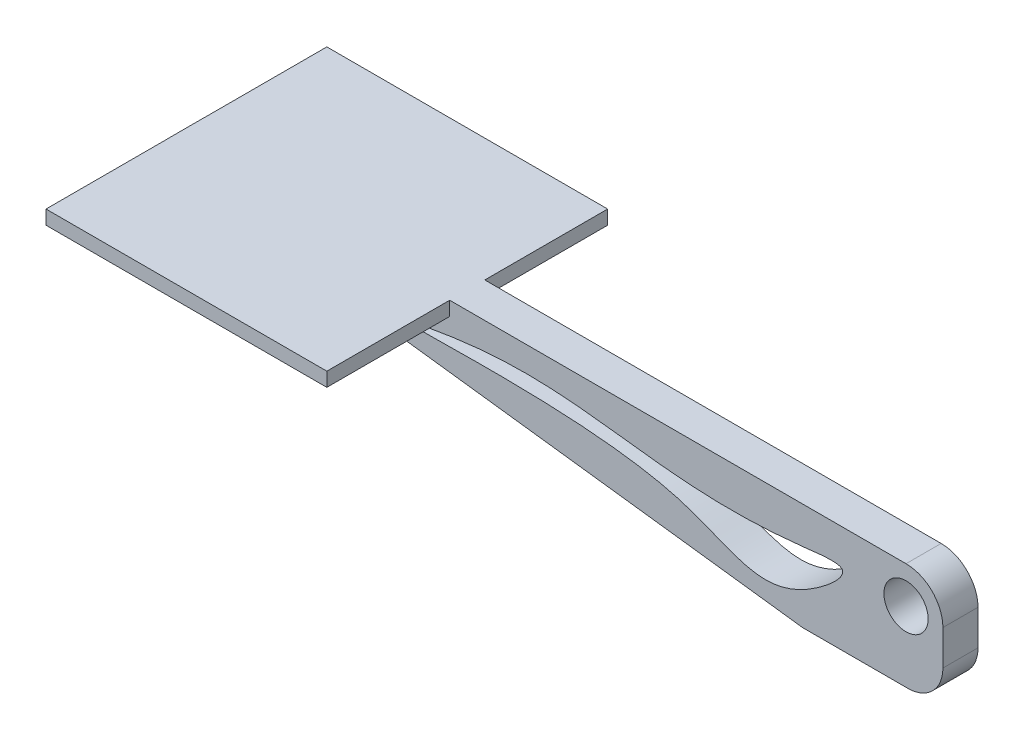
ISO-10303-21;
HEADER;
FILE_DESCRIPTION(('STEP AP214'),'2;1');
FILE_NAME('part.step','',(''),(''),'','','');
FILE_SCHEMA(('AUTOMOTIVE_DESIGN { 1 0 10303 214 1 1 1 1 }'));
ENDSEC;
DATA;
#1=APPLICATION_CONTEXT('core data for automotive mechanical design processes');
#2=APPLICATION_PROTOCOL_DEFINITION('international standard','automotive_design',2000,#1);
#3=PRODUCT_CONTEXT('',#1,'mechanical');
#4=PRODUCT('Part','Part','',(#3));
#5=PRODUCT_RELATED_PRODUCT_CATEGORY('part','',(#4));
#6=PRODUCT_DEFINITION_FORMATION('','',#4);
#7=PRODUCT_DEFINITION_CONTEXT('part definition',#1,'design');
#8=PRODUCT_DEFINITION('design','',#6,#7);
#9=PRODUCT_DEFINITION_SHAPE('','',#8);
#10=(LENGTH_UNIT() NAMED_UNIT(*) SI_UNIT(.MILLI.,.METRE.));
#11=(NAMED_UNIT(*) PLANE_ANGLE_UNIT() SI_UNIT($,.RADIAN.));
#12=(NAMED_UNIT(*) SI_UNIT($,.STERADIAN.) SOLID_ANGLE_UNIT());
#13=UNCERTAINTY_MEASURE_WITH_UNIT(LENGTH_MEASURE(1.E-05),#10,'distance_accuracy_value','');
#14=(GEOMETRIC_REPRESENTATION_CONTEXT(3) GLOBAL_UNCERTAINTY_ASSIGNED_CONTEXT((#13)) GLOBAL_UNIT_ASSIGNED_CONTEXT((#10,
#11,#12)) REPRESENTATION_CONTEXT('',''));
#15=CARTESIAN_POINT('',(0.,0.,0.));
#16=DIRECTION('',(0.,0.,1.));
#17=DIRECTION('',(1.,0.,0.));
#18=AXIS2_PLACEMENT_3D('',#15,#16,#17);
#19=CARTESIAN_POINT('',(0.,0.,-5.));
#20=DIRECTION('',(0.,0.,1.));
#21=DIRECTION('',(1.,0.,0.));
#22=AXIS2_PLACEMENT_3D('',#19,#20,#21);
#23=PLANE('',#22);
#24=CARTESIAN_POINT('',(-29.5,0.,-5.));
#25=CARTESIAN_POINT('',(-71.2154527835419,-4.61892144301834,-5.));
#26=CARTESIAN_POINT('',(-91.249553359035,8.29560441948552,-5.));
#27=CARTESIAN_POINT('',(-167.314221677609,-4.51637823923124,-5.));
#28=CARTESIAN_POINT('',(-66.6604627525352,5.70599052736748,-5.));
#29=CARTESIAN_POINT('',(-39.3547437867582,-20.8236487299259,-5.));
#30=CARTESIAN_POINT('',(-11.8773746369472,2.38963550250183,-5.));
#31=CARTESIAN_POINT('',(-24.5233427174819,0.551037745078615,-5.));
#32=CARTESIAN_POINT('',(-29.5,0.,-5.));
#33=B_SPLINE_CURVE_WITH_KNOTS('',3,(#24,#25,#26,#27,#28,#29,#30,#31,#32),.UNSPECIFIED.,.T.,.F.,
(4,1,1,1,1,1,4),(0.,0.381705306503049,0.445280413079072,0.748987595762117,0.891875490341652,
0.954462522479591,1.),.UNSPECIFIED.);
#34=CARTESIAN_POINT('',(-29.5,0.,-5.));
#35=VERTEX_POINT('',#34);
#36=EDGE_CURVE('E313',#35,#35,#33,.T.);
#37=ORIENTED_EDGE('',*,*,#36,.T.);
#38=EDGE_LOOP('',(#37));
#39=FACE_BOUND('',#38,.T.);
#40=CARTESIAN_POINT('',(0.,0.,-5.));
#41=DIRECTION('',(0.,0.,1.));
#42=DIRECTION('',(1.,0.,0.));
#43=AXIS2_PLACEMENT_3D('',#40,#41,#42);
#44=CIRCLE('',#43,6.3);
#45=CARTESIAN_POINT('',(6.3,0.,-5.));
#46=VERTEX_POINT('',#45);
#47=EDGE_CURVE('E280',#46,#46,#44,.T.);
#48=ORIENTED_EDGE('',*,*,#47,.T.);
#49=EDGE_LOOP('',(#48));
#50=FACE_BOUND('',#49,.T.);
#51=DIRECTION('',(0.,1.,0.));
#52=VECTOR('',#51,1.);
#53=CARTESIAN_POINT('',(-210.,0.,-5.));
#54=LINE('',#53,#52);
#55=CARTESIAN_POINT('',(-210.,6.49999999999997,-5.));
#56=VERTEX_POINT('',#55);
#57=CARTESIAN_POINT('',(-210.,10.5,-5.));
#58=VERTEX_POINT('',#57);
#59=EDGE_CURVE('E239',#56,#58,#54,.T.);
#60=ORIENTED_EDGE('',*,*,#59,.F.);
#61=DIRECTION('',(-1.,0.,0.));
#62=VECTOR('',#61,1.);
#63=CARTESIAN_POINT('',(0.,6.5,-5.));
#64=LINE('',#63,#62);
#65=CARTESIAN_POINT('',(-130.,6.49999999999998,-5.));
#66=VERTEX_POINT('',#65);
#67=EDGE_CURVE('E79',#66,#56,#64,.T.);
#68=ORIENTED_EDGE('',*,*,#67,.F.);
#69=DIRECTION('',(0.,1.,0.));
#70=VECTOR('',#69,1.);
#71=CARTESIAN_POINT('',(-130.,0.,-5.));
#72=LINE('',#71,#70);
#73=CARTESIAN_POINT('',(-130.,10.5,-5.));
#74=VERTEX_POINT('',#73);
#75=EDGE_CURVE('E237',#66,#74,#72,.T.);
#76=ORIENTED_EDGE('',*,*,#75,.T.);
#77=DIRECTION('',(-1.,0.,0.));
#78=VECTOR('',#77,1.);
#79=CARTESIAN_POINT('',(0.,10.5,-5.));
#80=LINE('',#79,#78);
#81=CARTESIAN_POINT('',(0.,10.5,-5.));
#82=VERTEX_POINT('',#81);
#83=EDGE_CURVE('E289',#82,#74,#80,.T.);
#84=ORIENTED_EDGE('',*,*,#83,.F.);
#85=CARTESIAN_POINT('',(0.,0.,-5.));
#86=DIRECTION('',(0.,0.,1.));
#87=DIRECTION('',(1.,0.,0.));
#88=AXIS2_PLACEMENT_3D('',#85,#86,#87);
#89=CIRCLE('',#88,10.5);
#90=CARTESIAN_POINT('',(10.5,0.,-5.));
#91=VERTEX_POINT('',#90);
#92=EDGE_CURVE('E286',#91,#82,#89,.T.);
#93=ORIENTED_EDGE('',*,*,#92,.F.);
#94=DIRECTION('',(0.,-1.,0.));
#95=VECTOR('',#94,1.);
#96=CARTESIAN_POINT('',(10.5,0.,-5.));
#97=LINE('',#96,#95);
#98=CARTESIAN_POINT('',(10.5,-9.99999999999993,-5.));
#99=VERTEX_POINT('',#98);
#100=EDGE_CURVE('E311',#91,#99,#97,.T.);
#101=ORIENTED_EDGE('',*,*,#100,.T.);
#102=CARTESIAN_POINT('',(0.500000000000002,-10.,-5.));
#103=DIRECTION('',(0.,0.,1.));
#104=DIRECTION('',(1.,0.,0.));
#105=AXIS2_PLACEMENT_3D('',#102,#103,#104);
#106=CIRCLE('',#105,10.);
#107=CARTESIAN_POINT('',(0.499999999999931,-20.,-5.));
#108=VERTEX_POINT('',#107);
#109=EDGE_CURVE('E308',#108,#99,#106,.T.);
#110=ORIENTED_EDGE('',*,*,#109,.F.);
#111=DIRECTION('',(-1.,0.,0.));
#112=VECTOR('',#111,1.);
#113=CARTESIAN_POINT('',(0.,-20.,-5.));
#114=LINE('',#113,#112);
#115=CARTESIAN_POINT('',(-29.5,-20.,-5.));
#116=VERTEX_POINT('',#115);
#117=EDGE_CURVE('E305',#108,#116,#114,.T.);
#118=ORIENTED_EDGE('',*,*,#117,.T.);
#119=DIRECTION('',(-0.992075031779354,0.125646851611941,0.));
#120=VECTOR('',#119,1.);
#121=CARTESIAN_POINT('',(-2.95874246005763,-23.361464950624,-5.));
#122=LINE('',#121,#120);
#123=CARTESIAN_POINT('',(-168.748530027059,-2.36409663681365,-5.));
#124=VERTEX_POINT('',#123);
#125=EDGE_CURVE('E303',#116,#124,#122,.T.);
#126=ORIENTED_EDGE('',*,*,#125,.T.);
#127=CARTESIAN_POINT('',(-171.261467059298,-22.2055972724007,-5.));
#128=DIRECTION('',(0.,0.,1.));
#129=DIRECTION('',(1.,0.,0.));
#130=AXIS2_PLACEMENT_3D('',#127,#128,#129);
#131=CIRCLE('',#130,20.);
#132=CARTESIAN_POINT('',(-171.261467059298,-2.20559727240073,-5.));
#133=VERTEX_POINT('',#132);
#134=EDGE_CURVE('E300',#133,#124,#131,.F.);
#135=ORIENTED_EDGE('',*,*,#134,.F.);
#136=DIRECTION('',(-1.,0.,0.));
#137=VECTOR('',#136,1.);
#138=CARTESIAN_POINT('',(0.,-2.20559727240071,-5.));
#139=LINE('',#138,#137);
#140=CARTESIAN_POINT('',(-202.51657919674,-2.20559727240073,-5.));
#141=VERTEX_POINT('',#140);
#142=EDGE_CURVE('E297',#133,#141,#139,.T.);
#143=ORIENTED_EDGE('',*,*,#142,.T.);
#144=CARTESIAN_POINT('',(-202.51657919674,5.29440272759927,-5.));
#145=DIRECTION('',(0.,0.,1.));
#146=DIRECTION('',(1.,0.,0.));
#147=AXIS2_PLACEMENT_3D('',#144,#145,#146);
#148=CIRCLE('',#147,7.5);
#149=CARTESIAN_POINT('',(-210.01657919674,5.29440272759927,-5.));
#150=VERTEX_POINT('',#149);
#151=EDGE_CURVE('E294',#141,#150,#148,.F.);
#152=ORIENTED_EDGE('',*,*,#151,.T.);
#153=DIRECTION('',(0.,1.,0.));
#154=VECTOR('',#153,1.);
#155=CARTESIAN_POINT('',(-210.01657919674,0.,-5.));
#156=LINE('',#155,#154);
#157=CARTESIAN_POINT('',(-210.01657919674,10.5,-5.));
#158=VERTEX_POINT('',#157);
#159=EDGE_CURVE('E292',#150,#158,#156,.T.);
#160=ORIENTED_EDGE('',*,*,#159,.T.);
#161=EDGE_CURVE('E85',#58,#158,#80,.T.);
#162=ORIENTED_EDGE('',*,*,#161,.F.);
#163=EDGE_LOOP('',(#60,#68,#76,#84,#93,#101,#110,#118,#126,#135,#143,#152,#160,#162));
#164=FACE_BOUND('',#163,.T.);
#165=ADVANCED_FACE('F64',(#39,#50,#164),#23,.F.);
#166=CARTESIAN_POINT('',(0.,0.,5.));
#167=DIRECTION('',(0.,0.,1.));
#168=DIRECTION('',(1.,0.,0.));
#169=AXIS2_PLACEMENT_3D('',#166,#167,#168);
#170=PLANE('',#169);
#171=CARTESIAN_POINT('',(0.,0.,5.));
#172=DIRECTION('',(0.,0.,1.));
#173=DIRECTION('',(1.,0.,0.));
#174=AXIS2_PLACEMENT_3D('',#171,#172,#173);
#175=CIRCLE('',#174,6.3);
#176=CARTESIAN_POINT('',(6.3,0.,5.));
#177=VERTEX_POINT('',#176);
#178=EDGE_CURVE('E241',#177,#177,#175,.T.);
#179=ORIENTED_EDGE('',*,*,#178,.F.);
#180=EDGE_LOOP('',(#179));
#181=FACE_BOUND('',#180,.T.);
#182=CARTESIAN_POINT('',(-29.5,0.,5.));
#183=CARTESIAN_POINT('',(-71.2154527835419,-4.61892144301834,5.));
#184=CARTESIAN_POINT('',(-91.249553359035,8.29560441948552,5.));
#185=CARTESIAN_POINT('',(-167.314221677609,-4.51637823923124,5.));
#186=CARTESIAN_POINT('',(-66.6604627525352,5.70599052736748,5.));
#187=CARTESIAN_POINT('',(-39.3547437867582,-20.8236487299259,5.));
#188=CARTESIAN_POINT('',(-11.8773746369472,2.38963550250183,5.));
#189=CARTESIAN_POINT('',(-24.5233427174819,0.551037745078615,5.));
#190=CARTESIAN_POINT('',(-29.5,0.,5.));
#191=B_SPLINE_CURVE_WITH_KNOTS('',3,(#182,#183,#184,#185,#186,#187,#188,#189,#190),
.UNSPECIFIED.,.T.,.F.,(4,1,1,1,1,1,4),(0.,0.381705306503049,0.445280413079072,0.748987595762117,
0.891875490341652,0.954462522479591,1.),.UNSPECIFIED.);
#192=CARTESIAN_POINT('',(-29.5,0.,5.));
#193=VERTEX_POINT('',#192);
#194=EDGE_CURVE('E275',#193,#193,#191,.T.);
#195=ORIENTED_EDGE('',*,*,#194,.F.);
#196=EDGE_LOOP('',(#195));
#197=FACE_BOUND('',#196,.T.);
#198=DIRECTION('',(-1.,0.,0.));
#199=VECTOR('',#198,1.);
#200=CARTESIAN_POINT('',(0.,6.5,5.));
#201=LINE('',#200,#199);
#202=CARTESIAN_POINT('',(-130.,6.49999999999998,5.));
#203=VERTEX_POINT('',#202);
#204=CARTESIAN_POINT('',(-210.,6.49999999999997,5.));
#205=VERTEX_POINT('',#204);
#206=EDGE_CURVE('E207',#203,#205,#201,.T.);
#207=ORIENTED_EDGE('',*,*,#206,.T.);
#208=DIRECTION('',(0.,1.,0.));
#209=VECTOR('',#208,1.);
#210=CARTESIAN_POINT('',(-210.,0.,5.));
#211=LINE('',#210,#209);
#212=CARTESIAN_POINT('',(-210.,10.5,5.));
#213=VERTEX_POINT('',#212);
#214=EDGE_CURVE('E12',#205,#213,#211,.T.);
#215=ORIENTED_EDGE('',*,*,#214,.T.);
#216=DIRECTION('',(-1.,0.,0.));
#217=VECTOR('',#216,1.);
#218=CARTESIAN_POINT('',(0.,10.5,5.));
#219=LINE('',#218,#217);
#220=CARTESIAN_POINT('',(-210.01657919674,10.5,5.));
#221=VERTEX_POINT('',#220);
#222=EDGE_CURVE('E247',#213,#221,#219,.T.);
#223=ORIENTED_EDGE('',*,*,#222,.T.);
#224=DIRECTION('',(0.,1.,0.));
#225=VECTOR('',#224,1.);
#226=CARTESIAN_POINT('',(-210.01657919674,0.,5.));
#227=LINE('',#226,#225);
#228=CARTESIAN_POINT('',(-210.01657919674,5.29440272759927,5.));
#229=VERTEX_POINT('',#228);
#230=EDGE_CURVE('E251',#229,#221,#227,.T.);
#231=ORIENTED_EDGE('',*,*,#230,.F.);
#232=CARTESIAN_POINT('',(-202.51657919674,5.29440272759927,5.));
#233=DIRECTION('',(0.,0.,1.));
#234=DIRECTION('',(1.,0.,0.));
#235=AXIS2_PLACEMENT_3D('',#232,#233,#234);
#236=CIRCLE('',#235,7.5);
#237=CARTESIAN_POINT('',(-202.51657919674,-2.20559727240073,5.));
#238=VERTEX_POINT('',#237);
#239=EDGE_CURVE('E254',#238,#229,#236,.F.);
#240=ORIENTED_EDGE('',*,*,#239,.F.);
#241=DIRECTION('',(-1.,0.,0.));
#242=VECTOR('',#241,1.);
#243=CARTESIAN_POINT('',(0.,-2.20559727240071,5.));
#244=LINE('',#243,#242);
#245=CARTESIAN_POINT('',(-171.261467059298,-2.20559727240073,5.));
#246=VERTEX_POINT('',#245);
#247=EDGE_CURVE('E257',#246,#238,#244,.T.);
#248=ORIENTED_EDGE('',*,*,#247,.F.);
#249=CARTESIAN_POINT('',(-171.261467059298,-22.2055972724007,5.));
#250=DIRECTION('',(0.,0.,1.));
#251=DIRECTION('',(1.,0.,0.));
#252=AXIS2_PLACEMENT_3D('',#249,#250,#251);
#253=CIRCLE('',#252,20.);
#254=CARTESIAN_POINT('',(-168.748530027059,-2.36409663681365,5.));
#255=VERTEX_POINT('',#254);
#256=EDGE_CURVE('E260',#246,#255,#253,.F.);
#257=ORIENTED_EDGE('',*,*,#256,.T.);
#258=DIRECTION('',(-0.992075031779354,0.125646851611941,0.));
#259=VECTOR('',#258,1.);
#260=CARTESIAN_POINT('',(-2.95874246005763,-23.361464950624,5.));
#261=LINE('',#260,#259);
#262=CARTESIAN_POINT('',(-29.5,-20.,5.));
#263=VERTEX_POINT('',#262);
#264=EDGE_CURVE('E263',#263,#255,#261,.T.);
#265=ORIENTED_EDGE('',*,*,#264,.F.);
#266=DIRECTION('',(-1.,0.,0.));
#267=VECTOR('',#266,1.);
#268=CARTESIAN_POINT('',(0.,-20.,5.));
#269=LINE('',#268,#267);
#270=CARTESIAN_POINT('',(0.499999999999931,-20.,5.));
#271=VERTEX_POINT('',#270);
#272=EDGE_CURVE('E266',#271,#263,#269,.T.);
#273=ORIENTED_EDGE('',*,*,#272,.F.);
#274=CARTESIAN_POINT('',(0.500000000000002,-10.,5.));
#275=DIRECTION('',(0.,0.,1.));
#276=DIRECTION('',(1.,0.,0.));
#277=AXIS2_PLACEMENT_3D('',#274,#275,#276);
#278=CIRCLE('',#277,10.);
#279=CARTESIAN_POINT('',(10.5,-9.99999999999993,5.));
#280=VERTEX_POINT('',#279);
#281=EDGE_CURVE('E269',#271,#280,#278,.T.);
#282=ORIENTED_EDGE('',*,*,#281,.T.);
#283=DIRECTION('',(0.,-1.,0.));
#284=VECTOR('',#283,1.);
#285=CARTESIAN_POINT('',(10.5,0.,5.));
#286=LINE('',#285,#284);
#287=CARTESIAN_POINT('',(10.5,0.,5.));
#288=VERTEX_POINT('',#287);
#289=EDGE_CURVE('E272',#288,#280,#286,.T.);
#290=ORIENTED_EDGE('',*,*,#289,.F.);
#291=CARTESIAN_POINT('',(0.,0.,5.));
#292=DIRECTION('',(0.,0.,1.));
#293=DIRECTION('',(1.,0.,0.));
#294=AXIS2_PLACEMENT_3D('',#291,#292,#293);
#295=CIRCLE('',#294,10.5);
#296=CARTESIAN_POINT('',(0.,10.5,5.));
#297=VERTEX_POINT('',#296);
#298=EDGE_CURVE('E244',#288,#297,#295,.T.);
#299=ORIENTED_EDGE('',*,*,#298,.T.);
#300=CARTESIAN_POINT('',(-130.,10.5,5.));
#301=VERTEX_POINT('',#300);
#302=EDGE_CURVE('E248',#297,#301,#219,.T.);
#303=ORIENTED_EDGE('',*,*,#302,.T.);
#304=DIRECTION('',(0.,1.,0.));
#305=VECTOR('',#304,1.);
#306=CARTESIAN_POINT('',(-130.,0.,5.));
#307=LINE('',#306,#305);
#308=EDGE_CURVE('E72',#203,#301,#307,.T.);
#309=ORIENTED_EDGE('',*,*,#308,.F.);
#310=EDGE_LOOP('',(#207,#215,#223,#231,#240,#248,#257,#265,#273,#282,#290,#299,#303,#309));
#311=FACE_BOUND('',#310,.T.);
#312=ADVANCED_FACE('F369',(#181,#197,#311),#170,.T.);
#313=CARTESIAN_POINT('',(0.,0.,-5.));
#314=DIRECTION('',(0.,0.,1.));
#315=DIRECTION('',(1.,0.,0.));
#316=AXIS2_PLACEMENT_3D('',#313,#314,#315);
#317=CYLINDRICAL_SURFACE('',#316,10.5);
#318=DIRECTION('',(0.,0.,1.));
#319=VECTOR('',#318,1.);
#320=CARTESIAN_POINT('',(0.,10.5,-5.));
#321=LINE('',#320,#319);
#322=EDGE_CURVE('E319',#82,#297,#321,.T.);
#323=ORIENTED_EDGE('',*,*,#322,.T.);
#324=ORIENTED_EDGE('',*,*,#298,.F.);
#325=DIRECTION('',(0.,0.,1.));
#326=VECTOR('',#325,1.);
#327=CARTESIAN_POINT('',(10.5,0.,-5.));
#328=LINE('',#327,#326);
#329=EDGE_CURVE('E320',#91,#288,#328,.T.);
#330=ORIENTED_EDGE('',*,*,#329,.F.);
#331=ORIENTED_EDGE('',*,*,#92,.T.);
#332=EDGE_LOOP('',(#323,#324,#330,#331));
#333=FACE_BOUND('',#332,.T.);
#334=ADVANCED_FACE('F336',(#333),#317,.T.);
#335=CARTESIAN_POINT('',(10.5,0.,-5.));
#336=DIRECTION('',(-1.,0.,0.));
#337=DIRECTION('',(0.,0.,1.));
#338=AXIS2_PLACEMENT_3D('',#335,#336,#337);
#339=PLANE('',#338);
#340=ORIENTED_EDGE('',*,*,#329,.T.);
#341=ORIENTED_EDGE('',*,*,#289,.T.);
#342=DIRECTION('',(0.,0.,1.));
#343=VECTOR('',#342,1.);
#344=CARTESIAN_POINT('',(10.5,-9.99999999999993,-5.));
#345=LINE('',#344,#343);
#346=EDGE_CURVE('E413',#99,#280,#345,.T.);
#347=ORIENTED_EDGE('',*,*,#346,.F.);
#348=ORIENTED_EDGE('',*,*,#100,.F.);
#349=EDGE_LOOP('',(#340,#341,#347,#348));
#350=FACE_BOUND('',#349,.T.);
#351=ADVANCED_FACE('F332',(#350),#339,.F.);
#352=CARTESIAN_POINT('',(0.500000000000002,-10.,-5.));
#353=DIRECTION('',(0.,0.,1.));
#354=DIRECTION('',(1.,0.,0.));
#355=AXIS2_PLACEMENT_3D('',#352,#353,#354);
#356=CYLINDRICAL_SURFACE('',#355,10.);
#357=ORIENTED_EDGE('',*,*,#346,.T.);
#358=ORIENTED_EDGE('',*,*,#281,.F.);
#359=DIRECTION('',(0.,0.,1.));
#360=VECTOR('',#359,1.);
#361=CARTESIAN_POINT('',(0.499999999999931,-20.,-5.));
#362=LINE('',#361,#360);
#363=EDGE_CURVE('E419',#108,#271,#362,.T.);
#364=ORIENTED_EDGE('',*,*,#363,.F.);
#365=ORIENTED_EDGE('',*,*,#109,.T.);
#366=EDGE_LOOP('',(#357,#358,#364,#365));
#367=FACE_BOUND('',#366,.T.);
#368=ADVANCED_FACE('F335',(#367),#356,.T.);
#369=CARTESIAN_POINT('',(0.,-20.,-5.));
#370=DIRECTION('',(0.,1.,0.));
#371=DIRECTION('',(-1.,0.,0.));
#372=AXIS2_PLACEMENT_3D('',#369,#370,#371);
#373=PLANE('',#372);
#374=ORIENTED_EDGE('',*,*,#363,.T.);
#375=ORIENTED_EDGE('',*,*,#272,.T.);
#376=DIRECTION('',(0.,0.,1.));
#377=VECTOR('',#376,1.);
#378=CARTESIAN_POINT('',(-29.5,-20.,-5.));
#379=LINE('',#378,#377);
#380=EDGE_CURVE('E421',#116,#263,#379,.T.);
#381=ORIENTED_EDGE('',*,*,#380,.F.);
#382=ORIENTED_EDGE('',*,*,#117,.F.);
#383=EDGE_LOOP('',(#374,#375,#381,#382));
#384=FACE_BOUND('',#383,.T.);
#385=ADVANCED_FACE('F340',(#384),#373,.F.);
#386=CARTESIAN_POINT('',(-2.95874246005763,-23.361464950624,-5.));
#387=DIRECTION('',(0.125646851611941,0.992075031779354,0.));
#388=DIRECTION('',(-0.992075031779354,0.125646851611941,0.));
#389=AXIS2_PLACEMENT_3D('',#386,#387,#388);
#390=PLANE('',#389);
#391=ORIENTED_EDGE('',*,*,#380,.T.);
#392=ORIENTED_EDGE('',*,*,#264,.T.);
#393=DIRECTION('',(0.,0.,1.));
#394=VECTOR('',#393,1.);
#395=CARTESIAN_POINT('',(-168.748530027059,-2.36409663681365,-5.));
#396=LINE('',#395,#394);
#397=EDGE_CURVE('E424',#124,#255,#396,.T.);
#398=ORIENTED_EDGE('',*,*,#397,.F.);
#399=ORIENTED_EDGE('',*,*,#125,.F.);
#400=EDGE_LOOP('',(#391,#392,#398,#399));
#401=FACE_BOUND('',#400,.T.);
#402=ADVANCED_FACE('F344',(#401),#390,.F.);
#403=CARTESIAN_POINT('',(-171.261467059298,-22.2055972724007,-5.));
#404=DIRECTION('',(0.,0.,1.));
#405=DIRECTION('',(1.,0.,0.));
#406=AXIS2_PLACEMENT_3D('',#403,#404,#405);
#407=CYLINDRICAL_SURFACE('',#406,20.);
#408=ORIENTED_EDGE('',*,*,#397,.T.);
#409=ORIENTED_EDGE('',*,*,#256,.F.);
#410=DIRECTION('',(0.,0.,1.));
#411=VECTOR('',#410,1.);
#412=CARTESIAN_POINT('',(-171.261467059298,-2.20559727240073,-5.));
#413=LINE('',#412,#411);
#414=EDGE_CURVE('E426',#133,#246,#413,.T.);
#415=ORIENTED_EDGE('',*,*,#414,.F.);
#416=ORIENTED_EDGE('',*,*,#134,.T.);
#417=EDGE_LOOP('',(#408,#409,#415,#416));
#418=FACE_BOUND('',#417,.T.);
#419=ADVANCED_FACE('F348',(#418),#407,.F.);
#420=CARTESIAN_POINT('',(0.,-2.20559727240071,-5.));
#421=DIRECTION('',(0.,1.,0.));
#422=DIRECTION('',(-1.,0.,0.));
#423=AXIS2_PLACEMENT_3D('',#420,#421,#422);
#424=PLANE('',#423);
#425=ORIENTED_EDGE('',*,*,#414,.T.);
#426=ORIENTED_EDGE('',*,*,#247,.T.);
#427=DIRECTION('',(0.,0.,1.));
#428=VECTOR('',#427,1.);
#429=CARTESIAN_POINT('',(-202.51657919674,-2.20559727240073,-5.));
#430=LINE('',#429,#428);
#431=EDGE_CURVE('E430',#141,#238,#430,.T.);
#432=ORIENTED_EDGE('',*,*,#431,.F.);
#433=ORIENTED_EDGE('',*,*,#142,.F.);
#434=EDGE_LOOP('',(#425,#426,#432,#433));
#435=FACE_BOUND('',#434,.T.);
#436=ADVANCED_FACE('F352',(#435),#424,.F.);
#437=CARTESIAN_POINT('',(-202.51657919674,5.29440272759927,-5.));
#438=DIRECTION('',(0.,0.,1.));
#439=DIRECTION('',(1.,0.,0.));
#440=AXIS2_PLACEMENT_3D('',#437,#438,#439);
#441=CYLINDRICAL_SURFACE('',#440,7.5);
#442=ORIENTED_EDGE('',*,*,#431,.T.);
#443=ORIENTED_EDGE('',*,*,#239,.T.);
#444=DIRECTION('',(0.,0.,1.));
#445=VECTOR('',#444,1.);
#446=CARTESIAN_POINT('',(-210.01657919674,5.29440272759927,-5.));
#447=LINE('',#446,#445);
#448=EDGE_CURVE('E405',#150,#229,#447,.T.);
#449=ORIENTED_EDGE('',*,*,#448,.F.);
#450=ORIENTED_EDGE('',*,*,#151,.F.);
#451=EDGE_LOOP('',(#442,#443,#449,#450));
#452=FACE_BOUND('',#451,.T.);
#453=ADVANCED_FACE('F356',(#452),#441,.T.);
#454=CARTESIAN_POINT('',(-210.01657919674,0.,-5.));
#455=DIRECTION('',(1.,0.,0.));
#456=DIRECTION('',(0.,0.,-1.));
#457=AXIS2_PLACEMENT_3D('',#454,#455,#456);
#458=PLANE('',#457);
#459=ORIENTED_EDGE('',*,*,#448,.T.);
#460=ORIENTED_EDGE('',*,*,#230,.T.);
#461=DIRECTION('',(0.,0.,1.));
#462=VECTOR('',#461,1.);
#463=CARTESIAN_POINT('',(-210.01657919674,10.5,-5.));
#464=LINE('',#463,#462);
#465=EDGE_CURVE('E402',#158,#221,#464,.T.);
#466=ORIENTED_EDGE('',*,*,#465,.F.);
#467=ORIENTED_EDGE('',*,*,#159,.F.);
#468=EDGE_LOOP('',(#459,#460,#466,#467));
#469=FACE_BOUND('',#468,.T.);
#470=ADVANCED_FACE('F360',(#469),#458,.F.);
#471=CARTESIAN_POINT('',(0.,10.5,-5.));
#472=DIRECTION('',(0.,1.,0.));
#473=DIRECTION('',(-1.,0.,0.));
#474=AXIS2_PLACEMENT_3D('',#471,#472,#473);
#475=PLANE('',#474);
#476=ORIENTED_EDGE('',*,*,#83,.T.);
#477=DIRECTION('',(0.,0.,-1.));
#478=VECTOR('',#477,1.);
#479=CARTESIAN_POINT('',(-130.,10.5,0.));
#480=LINE('',#479,#478);
#481=CARTESIAN_POINT('',(-130.,10.5,-40.));
#482=VERTEX_POINT('',#481);
#483=EDGE_CURVE('E221',#74,#482,#480,.T.);
#484=ORIENTED_EDGE('',*,*,#483,.T.);
#485=DIRECTION('',(1.,0.,0.));
#486=VECTOR('',#485,1.);
#487=CARTESIAN_POINT('',(-210.,10.5,-40.));
#488=LINE('',#487,#486);
#489=CARTESIAN_POINT('',(-210.,10.5,-40.));
#490=VERTEX_POINT('',#489);
#491=EDGE_CURVE('E229',#490,#482,#488,.T.);
#492=ORIENTED_EDGE('',*,*,#491,.F.);
#493=DIRECTION('',(0.,0.,-1.));
#494=VECTOR('',#493,1.);
#495=CARTESIAN_POINT('',(-210.,10.5,0.));
#496=LINE('',#495,#494);
#497=EDGE_CURVE('E215',#58,#490,#496,.T.);
#498=ORIENTED_EDGE('',*,*,#497,.F.);
#499=ORIENTED_EDGE('',*,*,#161,.T.);
#500=ORIENTED_EDGE('',*,*,#465,.T.);
#501=ORIENTED_EDGE('',*,*,#222,.F.);
#502=CARTESIAN_POINT('',(-210.,10.5,40.));
#503=VERTEX_POINT('',#502);
#504=EDGE_CURVE('E213',#503,#213,#496,.T.);
#505=ORIENTED_EDGE('',*,*,#504,.F.);
#506=DIRECTION('',(1.,0.,0.));
#507=VECTOR('',#506,1.);
#508=CARTESIAN_POINT('',(0.,10.5,40.));
#509=LINE('',#508,#507);
#510=CARTESIAN_POINT('',(-130.,10.5,40.));
#511=VERTEX_POINT('',#510);
#512=EDGE_CURVE('E219',#503,#511,#509,.T.);
#513=ORIENTED_EDGE('',*,*,#512,.T.);
#514=EDGE_CURVE('E194',#511,#301,#480,.T.);
#515=ORIENTED_EDGE('',*,*,#514,.T.);
#516=ORIENTED_EDGE('',*,*,#302,.F.);
#517=ORIENTED_EDGE('',*,*,#322,.F.);
#518=EDGE_LOOP('',(#476,#484,#492,#498,#499,#500,#501,#505,#513,#515,#516,#517));
#519=FACE_BOUND('',#518,.T.);
#520=ADVANCED_FACE('F364',(#519),#475,.T.);
#521=CARTESIAN_POINT('',(0.,0.,-5.));
#522=DIRECTION('',(0.,0.,1.));
#523=DIRECTION('',(1.,0.,0.));
#524=AXIS2_PLACEMENT_3D('',#521,#522,#523);
#525=CYLINDRICAL_SURFACE('',#524,6.3);
#526=ORIENTED_EDGE('',*,*,#47,.F.);
#527=EDGE_LOOP('',(#526));
#528=FACE_BOUND('',#527,.T.);
#529=ORIENTED_EDGE('',*,*,#178,.T.);
#530=EDGE_LOOP('',(#529));
#531=FACE_BOUND('',#530,.T.);
#532=ADVANCED_FACE('F66',(#528,#531),#525,.F.);
#533=DIRECTION('',(0.,0.,1.));
#534=VECTOR('',#533,1.);
#535=SURFACE_OF_LINEAR_EXTRUSION('',#33,#534);
#536=ORIENTED_EDGE('',*,*,#36,.F.);
#537=EDGE_LOOP('',(#536));
#538=FACE_BOUND('',#537,.T.);
#539=ORIENTED_EDGE('',*,*,#194,.T.);
#540=EDGE_LOOP('',(#539));
#541=FACE_BOUND('',#540,.T.);
#542=ADVANCED_FACE('F326',(#538,#541),#535,.F.);
#543=CARTESIAN_POINT('',(0.,6.5,40.));
#544=DIRECTION('',(0.,0.,1.));
#545=DIRECTION('',(1.,0.,0.));
#546=AXIS2_PLACEMENT_3D('',#543,#544,#545);
#547=PLANE('',#546);
#548=ORIENTED_EDGE('',*,*,#512,.F.);
#549=DIRECTION('',(0.,1.,0.));
#550=VECTOR('',#549,1.);
#551=CARTESIAN_POINT('',(-210.,6.49999999999997,40.));
#552=LINE('',#551,#550);
#553=CARTESIAN_POINT('',(-210.,6.49999999999997,40.));
#554=VERTEX_POINT('',#553);
#555=EDGE_CURVE('E199',#554,#503,#552,.T.);
#556=ORIENTED_EDGE('',*,*,#555,.F.);
#557=DIRECTION('',(1.,0.,0.));
#558=VECTOR('',#557,1.);
#559=CARTESIAN_POINT('',(0.,6.5,40.));
#560=LINE('',#559,#558);
#561=CARTESIAN_POINT('',(-130.,6.49999999999998,40.));
#562=VERTEX_POINT('',#561);
#563=EDGE_CURVE('E205',#554,#562,#560,.T.);
#564=ORIENTED_EDGE('',*,*,#563,.T.);
#565=DIRECTION('',(0.,1.,0.));
#566=VECTOR('',#565,1.);
#567=CARTESIAN_POINT('',(-130.,6.49999999999998,40.));
#568=LINE('',#567,#566);
#569=EDGE_CURVE('E188',#562,#511,#568,.T.);
#570=ORIENTED_EDGE('',*,*,#569,.T.);
#571=EDGE_LOOP('',(#548,#556,#564,#570));
#572=FACE_BOUND('',#571,.T.);
#573=ADVANCED_FACE('F211',(#572),#547,.T.);
#574=CARTESIAN_POINT('',(0.,6.5,0.));
#575=DIRECTION('',(0.,1.,0.));
#576=DIRECTION('',(-1.,0.,0.));
#577=AXIS2_PLACEMENT_3D('',#574,#575,#576);
#578=PLANE('',#577);
#579=ORIENTED_EDGE('',*,*,#206,.F.);
#580=DIRECTION('',(0.,0.,-1.));
#581=VECTOR('',#580,1.);
#582=CARTESIAN_POINT('',(-130.,6.49999999999998,0.));
#583=LINE('',#582,#581);
#584=EDGE_CURVE('E191',#562,#203,#583,.T.);
#585=ORIENTED_EDGE('',*,*,#584,.F.);
#586=ORIENTED_EDGE('',*,*,#563,.F.);
#587=DIRECTION('',(0.,0.,-1.));
#588=VECTOR('',#587,1.);
#589=CARTESIAN_POINT('',(-210.,6.49999999999997,0.));
#590=LINE('',#589,#588);
#591=EDGE_CURVE('E200',#554,#205,#590,.T.);
#592=ORIENTED_EDGE('',*,*,#591,.T.);
#593=EDGE_LOOP('',(#579,#585,#586,#592));
#594=FACE_BOUND('',#593,.T.);
#595=ADVANCED_FACE('F204',(#594),#578,.F.);
#596=CARTESIAN_POINT('',(-130.,6.49999999999998,0.));
#597=DIRECTION('',(1.,0.,0.));
#598=DIRECTION('',(0.,1.,0.));
#599=AXIS2_PLACEMENT_3D('',#596,#597,#598);
#600=PLANE('',#599);
#601=ORIENTED_EDGE('',*,*,#584,.T.);
#602=ORIENTED_EDGE('',*,*,#308,.T.);
#603=ORIENTED_EDGE('',*,*,#514,.F.);
#604=ORIENTED_EDGE('',*,*,#569,.F.);
#605=EDGE_LOOP('',(#601,#602,#603,#604));
#606=FACE_BOUND('',#605,.T.);
#607=ADVANCED_FACE('F190',(#606),#600,.T.);
#608=CARTESIAN_POINT('',(-210.,6.49999999999997,0.));
#609=DIRECTION('',(1.,0.,0.));
#610=DIRECTION('',(0.,1.,0.));
#611=AXIS2_PLACEMENT_3D('',#608,#609,#610);
#612=PLANE('',#611);
#613=ORIENTED_EDGE('',*,*,#214,.F.);
#614=ORIENTED_EDGE('',*,*,#591,.F.);
#615=ORIENTED_EDGE('',*,*,#555,.T.);
#616=ORIENTED_EDGE('',*,*,#504,.T.);
#617=EDGE_LOOP('',(#613,#614,#615,#616));
#618=FACE_BOUND('',#617,.T.);
#619=ADVANCED_FACE('F444',(#618),#612,.F.);
#620=CARTESIAN_POINT('',(-210.,6.49999999999997,-40.));
#621=VERTEX_POINT('',#620);
#622=EDGE_CURVE('E208',#56,#621,#590,.T.);
#623=ORIENTED_EDGE('',*,*,#622,.F.);
#624=ORIENTED_EDGE('',*,*,#59,.T.);
#625=ORIENTED_EDGE('',*,*,#497,.T.);
#626=DIRECTION('',(0.,1.,0.));
#627=VECTOR('',#626,1.);
#628=CARTESIAN_POINT('',(-210.,6.49999999999997,-40.));
#629=LINE('',#628,#627);
#630=EDGE_CURVE('E228',#621,#490,#629,.T.);
#631=ORIENTED_EDGE('',*,*,#630,.F.);
#632=EDGE_LOOP('',(#623,#624,#625,#631));
#633=FACE_BOUND('',#632,.T.);
#634=ADVANCED_FACE('F389',(#633),#612,.F.);
#635=ORIENTED_EDGE('',*,*,#75,.F.);
#636=CARTESIAN_POINT('',(-130.,6.49999999999998,-40.));
#637=VERTEX_POINT('',#636);
#638=EDGE_CURVE('E209',#66,#637,#583,.T.);
#639=ORIENTED_EDGE('',*,*,#638,.T.);
#640=DIRECTION('',(0.,1.,0.));
#641=VECTOR('',#640,1.);
#642=CARTESIAN_POINT('',(-130.,6.49999999999998,-40.));
#643=LINE('',#642,#641);
#644=EDGE_CURVE('E222',#637,#482,#643,.T.);
#645=ORIENTED_EDGE('',*,*,#644,.T.);
#646=ORIENTED_EDGE('',*,*,#483,.F.);
#647=EDGE_LOOP('',(#635,#639,#645,#646));
#648=FACE_BOUND('',#647,.T.);
#649=ADVANCED_FACE('F397',(#648),#600,.T.);
#650=ORIENTED_EDGE('',*,*,#638,.F.);
#651=ORIENTED_EDGE('',*,*,#67,.T.);
#652=ORIENTED_EDGE('',*,*,#622,.T.);
#653=DIRECTION('',(1.,0.,0.));
#654=VECTOR('',#653,1.);
#655=CARTESIAN_POINT('',(-210.,6.49999999999997,-40.));
#656=LINE('',#655,#654);
#657=EDGE_CURVE('E225',#621,#637,#656,.T.);
#658=ORIENTED_EDGE('',*,*,#657,.T.);
#659=EDGE_LOOP('',(#650,#651,#652,#658));
#660=FACE_BOUND('',#659,.T.);
#661=ADVANCED_FACE('F387',(#660),#578,.F.);
#662=CARTESIAN_POINT('',(-210.,6.49999999999997,-40.));
#663=DIRECTION('',(0.,0.,1.));
#664=DIRECTION('',(1.,0.,0.));
#665=AXIS2_PLACEMENT_3D('',#662,#663,#664);
#666=PLANE('',#665);
#667=ORIENTED_EDGE('',*,*,#491,.T.);
#668=ORIENTED_EDGE('',*,*,#644,.F.);
#669=ORIENTED_EDGE('',*,*,#657,.F.);
#670=ORIENTED_EDGE('',*,*,#630,.T.);
#671=EDGE_LOOP('',(#667,#668,#669,#670));
#672=FACE_BOUND('',#671,.T.);
#673=ADVANCED_FACE('F394',(#672),#666,.F.);
#674=CLOSED_SHELL('',(#165,#312,#334,#351,#368,#385,#402,#419,#436,#453,#470,#520,#532,#542,
#573,#595,#607,#619,#634,#649,#661,#673));
#675=MANIFOLD_SOLID_BREP('B2',#674);
#676=ADVANCED_BREP_SHAPE_REPRESENTATION('',(#18,#675),#14);
#677=SHAPE_DEFINITION_REPRESENTATION(#9,#676);
ENDSEC;
END-ISO-10303-21;
